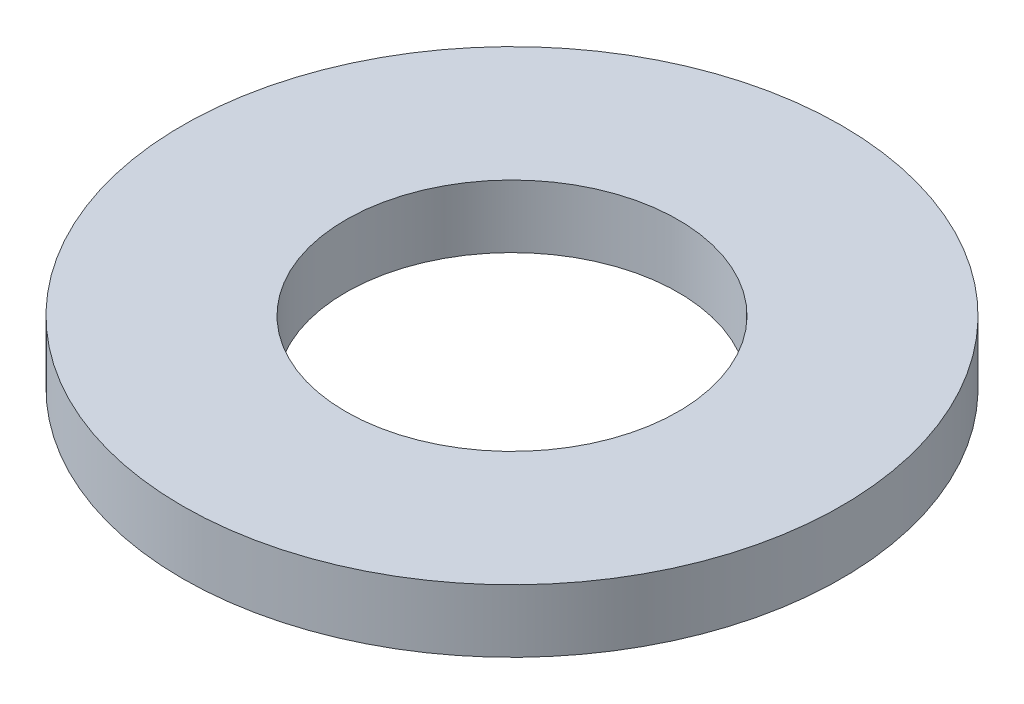
ISO-10303-21;
HEADER;
FILE_DESCRIPTION(('STEP AP214'),'2;1');
FILE_NAME('part.step','',(''),(''),'','','');
FILE_SCHEMA(('AUTOMOTIVE_DESIGN { 1 0 10303 214 1 1 1 1 }'));
ENDSEC;
DATA;
#1=APPLICATION_CONTEXT('core data for automotive mechanical design processes');
#2=APPLICATION_PROTOCOL_DEFINITION('international standard','automotive_design',2000,#1);
#3=PRODUCT_CONTEXT('',#1,'mechanical');
#4=PRODUCT('Part','Part','',(#3));
#5=PRODUCT_RELATED_PRODUCT_CATEGORY('part','',(#4));
#6=PRODUCT_DEFINITION_FORMATION('','',#4);
#7=PRODUCT_DEFINITION_CONTEXT('part definition',#1,'design');
#8=PRODUCT_DEFINITION('design','',#6,#7);
#9=PRODUCT_DEFINITION_SHAPE('','',#8);
#10=(LENGTH_UNIT() NAMED_UNIT(*) SI_UNIT(.MILLI.,.METRE.));
#11=(NAMED_UNIT(*) PLANE_ANGLE_UNIT() SI_UNIT($,.RADIAN.));
#12=(NAMED_UNIT(*) SI_UNIT($,.STERADIAN.) SOLID_ANGLE_UNIT());
#13=UNCERTAINTY_MEASURE_WITH_UNIT(LENGTH_MEASURE(1.E-05),#10,'distance_accuracy_value','');
#14=(GEOMETRIC_REPRESENTATION_CONTEXT(3) GLOBAL_UNCERTAINTY_ASSIGNED_CONTEXT((#13)) GLOBAL_UNIT_ASSIGNED_CONTEXT((#10,
#11,#12)) REPRESENTATION_CONTEXT('',''));
#15=CARTESIAN_POINT('',(0.,0.,0.));
#16=DIRECTION('',(0.,0.,1.));
#17=DIRECTION('',(1.,0.,0.));
#18=AXIS2_PLACEMENT_3D('',#15,#16,#17);
#19=CARTESIAN_POINT('',(0.,0.8382,0.));
#20=DIRECTION('',(0.,1.,0.));
#21=DIRECTION('',(0.,0.,1.));
#22=AXIS2_PLACEMENT_3D('',#19,#20,#21);
#23=PLANE('',#22);
#24=CARTESIAN_POINT('',(0.,0.8382,0.));
#25=DIRECTION('',(0.,1.,0.));
#26=DIRECTION('',(0.,0.,1.));
#27=AXIS2_PLACEMENT_3D('',#24,#25,#26);
#28=CIRCLE('',#27,8.7884);
#29=CARTESIAN_POINT('',(0.,0.8382,8.7884));
#30=VERTEX_POINT('',#29);
#31=EDGE_CURVE('E10',#30,#30,#28,.T.);
#32=ORIENTED_EDGE('',*,*,#31,.T.);
#33=EDGE_LOOP('',(#32));
#34=FACE_BOUND('',#33,.T.);
#35=CARTESIAN_POINT('',(0.,0.8382,0.));
#36=DIRECTION('',(0.,1.,0.));
#37=DIRECTION('',(0.,0.,1.));
#38=AXIS2_PLACEMENT_3D('',#35,#36,#37);
#39=CIRCLE('',#38,4.4323);
#40=CARTESIAN_POINT('',(0.,0.8382,4.4323));
#41=VERTEX_POINT('',#40);
#42=EDGE_CURVE('E48',#41,#41,#39,.T.);
#43=ORIENTED_EDGE('',*,*,#42,.F.);
#44=EDGE_LOOP('',(#43));
#45=FACE_BOUND('',#44,.T.);
#46=ADVANCED_FACE('F37',(#34,#45),#23,.T.);
#47=CARTESIAN_POINT('',(0.,-0.8382,0.));
#48=DIRECTION('',(0.,1.,0.));
#49=DIRECTION('',(0.,0.,1.));
#50=AXIS2_PLACEMENT_3D('',#47,#48,#49);
#51=PLANE('',#50);
#52=CARTESIAN_POINT('',(0.,-0.8382,0.));
#53=DIRECTION('',(0.,1.,0.));
#54=DIRECTION('',(0.,0.,1.));
#55=AXIS2_PLACEMENT_3D('',#52,#53,#54);
#56=CIRCLE('',#55,8.7884);
#57=CARTESIAN_POINT('',(0.,-0.8382,8.7884));
#58=VERTEX_POINT('',#57);
#59=EDGE_CURVE('E41',#58,#58,#56,.T.);
#60=ORIENTED_EDGE('',*,*,#59,.F.);
#61=EDGE_LOOP('',(#60));
#62=FACE_BOUND('',#61,.T.);
#63=CARTESIAN_POINT('',(0.,-0.8382,0.));
#64=DIRECTION('',(0.,1.,0.));
#65=DIRECTION('',(0.,0.,1.));
#66=AXIS2_PLACEMENT_3D('',#63,#64,#65);
#67=CIRCLE('',#66,4.4323);
#68=CARTESIAN_POINT('',(0.,-0.8382,4.4323));
#69=VERTEX_POINT('',#68);
#70=EDGE_CURVE('E50',#69,#69,#67,.T.);
#71=ORIENTED_EDGE('',*,*,#70,.T.);
#72=EDGE_LOOP('',(#71));
#73=FACE_BOUND('',#72,.T.);
#74=ADVANCED_FACE('F60',(#62,#73),#51,.F.);
#75=CARTESIAN_POINT('',(0.,0.8382,0.));
#76=DIRECTION('',(0.,-1.,0.));
#77=DIRECTION('',(0.,0.,-1.));
#78=AXIS2_PLACEMENT_3D('',#75,#76,#77);
#79=CYLINDRICAL_SURFACE('',#78,8.7884);
#80=ORIENTED_EDGE('',*,*,#31,.F.);
#81=EDGE_LOOP('',(#80));
#82=FACE_BOUND('',#81,.T.);
#83=ORIENTED_EDGE('',*,*,#59,.T.);
#84=EDGE_LOOP('',(#83));
#85=FACE_BOUND('',#84,.T.);
#86=ADVANCED_FACE('F39',(#82,#85),#79,.T.);
#87=CARTESIAN_POINT('',(0.,0.8382,0.));
#88=DIRECTION('',(0.,-1.,0.));
#89=DIRECTION('',(0.,0.,-1.));
#90=AXIS2_PLACEMENT_3D('',#87,#88,#89);
#91=CYLINDRICAL_SURFACE('',#90,4.4323);
#92=ORIENTED_EDGE('',*,*,#42,.T.);
#93=EDGE_LOOP('',(#92));
#94=FACE_BOUND('',#93,.T.);
#95=ORIENTED_EDGE('',*,*,#70,.F.);
#96=EDGE_LOOP('',(#95));
#97=FACE_BOUND('',#96,.T.);
#98=ADVANCED_FACE('F56',(#94,#97),#91,.F.);
#99=CLOSED_SHELL('',(#46,#74,#86,#98));
#100=MANIFOLD_SOLID_BREP('B2',#99);
#101=ADVANCED_BREP_SHAPE_REPRESENTATION('',(#18,#100),#14);
#102=SHAPE_DEFINITION_REPRESENTATION(#9,#101);
ENDSEC;
END-ISO-10303-21;
